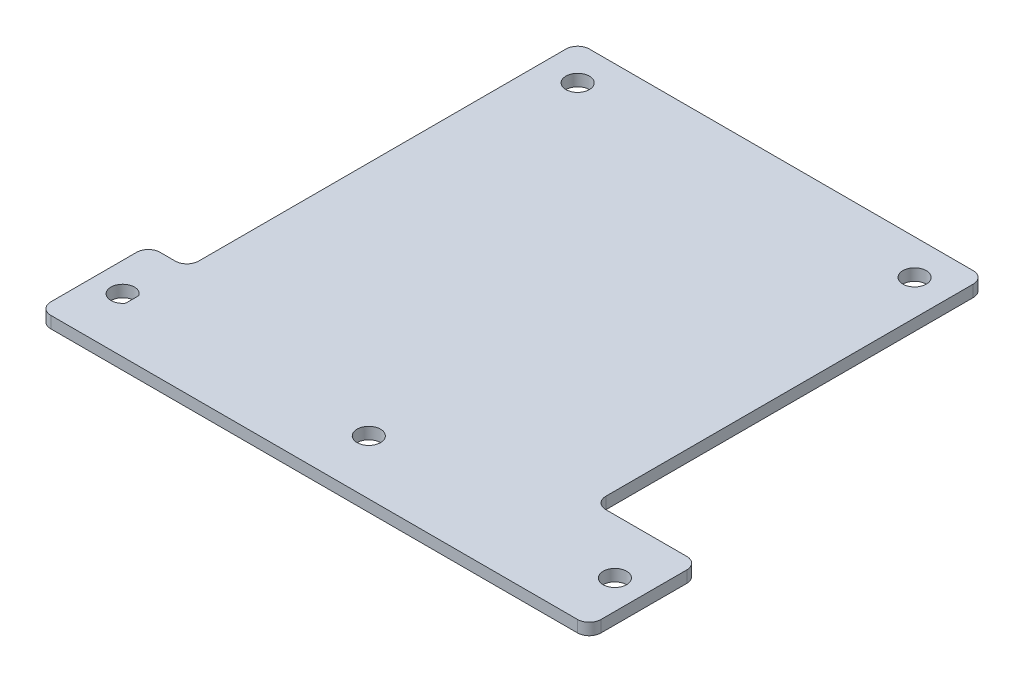
ISO-10303-21;
HEADER;
FILE_DESCRIPTION(('STEP AP214'),'2;1');
FILE_NAME('part.step','',(''),(''),'','','');
FILE_SCHEMA(('AUTOMOTIVE_DESIGN { 1 0 10303 214 1 1 1 1 }'));
ENDSEC;
DATA;
#1=APPLICATION_CONTEXT('core data for automotive mechanical design processes');
#2=APPLICATION_PROTOCOL_DEFINITION('international standard','automotive_design',2000,#1);
#3=PRODUCT_CONTEXT('',#1,'mechanical');
#4=PRODUCT('Part','Part','',(#3));
#5=PRODUCT_RELATED_PRODUCT_CATEGORY('part','',(#4));
#6=PRODUCT_DEFINITION_FORMATION('','',#4);
#7=PRODUCT_DEFINITION_CONTEXT('part definition',#1,'design');
#8=PRODUCT_DEFINITION('design','',#6,#7);
#9=PRODUCT_DEFINITION_SHAPE('','',#8);
#10=(LENGTH_UNIT() NAMED_UNIT(*) SI_UNIT(.MILLI.,.METRE.));
#11=(NAMED_UNIT(*) PLANE_ANGLE_UNIT() SI_UNIT($,.RADIAN.));
#12=(NAMED_UNIT(*) SI_UNIT($,.STERADIAN.) SOLID_ANGLE_UNIT());
#13=UNCERTAINTY_MEASURE_WITH_UNIT(LENGTH_MEASURE(1.E-05),#10,'distance_accuracy_value','');
#14=(GEOMETRIC_REPRESENTATION_CONTEXT(3) GLOBAL_UNCERTAINTY_ASSIGNED_CONTEXT((#13)) GLOBAL_UNIT_ASSIGNED_CONTEXT((#10,
#11,#12)) REPRESENTATION_CONTEXT('',''));
#15=CARTESIAN_POINT('',(0.,0.,0.));
#16=DIRECTION('',(0.,0.,1.));
#17=DIRECTION('',(1.,0.,0.));
#18=AXIS2_PLACEMENT_3D('',#15,#16,#17);
#19=CARTESIAN_POINT('',(-34.75,2.,0.));
#20=DIRECTION('',(1.,0.,0.));
#21=DIRECTION('',(0.,0.,-1.));
#22=AXIS2_PLACEMENT_3D('',#19,#20,#21);
#23=PLANE('',#22);
#24=DIRECTION('',(0.,1.,0.));
#25=VECTOR('',#24,1.);
#26=CARTESIAN_POINT('',(-34.75,0.,33.8656684183733));
#27=LINE('',#26,#25);
#28=CARTESIAN_POINT('',(-34.75,0.,33.8656684183733));
#29=VERTEX_POINT('',#28);
#30=CARTESIAN_POINT('',(-34.75,2.,33.8656684183733));
#31=VERTEX_POINT('',#30);
#32=EDGE_CURVE('E177',#29,#31,#27,.T.);
#33=ORIENTED_EDGE('',*,*,#32,.F.);
#34=DIRECTION('',(0.,0.,1.));
#35=VECTOR('',#34,1.);
#36=CARTESIAN_POINT('',(-34.75,0.,0.));
#37=LINE('',#36,#35);
#38=CARTESIAN_POINT('',(-34.75,0.,36.1343315816268));
#39=VERTEX_POINT('',#38);
#40=EDGE_CURVE('E183',#29,#39,#37,.T.);
#41=ORIENTED_EDGE('',*,*,#40,.T.);
#42=DIRECTION('',(0.,1.,0.));
#43=VECTOR('',#42,1.);
#44=CARTESIAN_POINT('',(-34.75,0.,36.1343315816268));
#45=LINE('',#44,#43);
#46=CARTESIAN_POINT('',(-34.75,2.,36.1343315816268));
#47=VERTEX_POINT('',#46);
#48=EDGE_CURVE('E167',#47,#39,#45,.F.);
#49=ORIENTED_EDGE('',*,*,#48,.F.);
#50=DIRECTION('',(0.,0.,1.));
#51=VECTOR('',#50,1.);
#52=CARTESIAN_POINT('',(-34.75,2.,0.));
#53=LINE('',#52,#51);
#54=EDGE_CURVE('E304',#31,#47,#53,.T.);
#55=ORIENTED_EDGE('',*,*,#54,.F.);
#56=EDGE_LOOP('',(#33,#41,#49,#55));
#57=FACE_BOUND('',#56,.T.);
#58=ADVANCED_FACE('F41',(#57),#23,.F.);
#59=CARTESIAN_POINT('',(-34.75,0.,-39.));
#60=VERTEX_POINT('',#59);
#61=CARTESIAN_POINT('',(-34.75,0.,23.680337554831));
#62=VERTEX_POINT('',#61);
#63=EDGE_CURVE('E187',#60,#62,#37,.T.);
#64=ORIENTED_EDGE('',*,*,#63,.T.);
#65=DIRECTION('',(0.,1.,0.));
#66=VECTOR('',#65,1.);
#67=CARTESIAN_POINT('',(-34.75,2.,23.680337554831));
#68=LINE('',#67,#66);
#69=CARTESIAN_POINT('',(-34.75,2.,23.680337554831));
#70=VERTEX_POINT('',#69);
#71=EDGE_CURVE('E212',#62,#70,#68,.T.);
#72=ORIENTED_EDGE('',*,*,#71,.T.);
#73=CARTESIAN_POINT('',(-34.75,2.,-39.));
#74=VERTEX_POINT('',#73);
#75=EDGE_CURVE('E273',#74,#70,#53,.T.);
#76=ORIENTED_EDGE('',*,*,#75,.F.);
#77=DIRECTION('',(0.,-1.,0.));
#78=VECTOR('',#77,1.);
#79=CARTESIAN_POINT('',(-34.75,2.,-39.));
#80=LINE('',#79,#78);
#81=EDGE_CURVE('E209',#74,#60,#80,.T.);
#82=ORIENTED_EDGE('',*,*,#81,.T.);
#83=EDGE_LOOP('',(#64,#72,#76,#82));
#84=FACE_BOUND('',#83,.T.);
#85=ADVANCED_FACE('F291',(#84),#23,.F.);
#86=CARTESIAN_POINT('',(0.,2.,-41.));
#87=DIRECTION('',(0.,0.,1.));
#88=DIRECTION('',(1.,0.,0.));
#89=AXIS2_PLACEMENT_3D('',#86,#87,#88);
#90=PLANE('',#89);
#91=DIRECTION('',(-1.,0.,0.));
#92=VECTOR('',#91,1.);
#93=CARTESIAN_POINT('',(0.,0.,-41.));
#94=LINE('',#93,#92);
#95=CARTESIAN_POINT('',(32.75,0.,-41.));
#96=VERTEX_POINT('',#95);
#97=CARTESIAN_POINT('',(-32.75,0.,-41.));
#98=VERTEX_POINT('',#97);
#99=EDGE_CURVE('E188',#96,#98,#94,.T.);
#100=ORIENTED_EDGE('',*,*,#99,.T.);
#101=DIRECTION('',(0.,-1.,0.));
#102=VECTOR('',#101,1.);
#103=CARTESIAN_POINT('',(-32.75,2.,-41.));
#104=LINE('',#103,#102);
#105=CARTESIAN_POINT('',(-32.75,2.,-41.));
#106=VERTEX_POINT('',#105);
#107=EDGE_CURVE('E254',#98,#106,#104,.F.);
#108=ORIENTED_EDGE('',*,*,#107,.T.);
#109=DIRECTION('',(-1.,0.,0.));
#110=VECTOR('',#109,1.);
#111=CARTESIAN_POINT('',(0.,2.,-41.));
#112=LINE('',#111,#110);
#113=CARTESIAN_POINT('',(32.75,2.,-41.));
#114=VERTEX_POINT('',#113);
#115=EDGE_CURVE('E301',#114,#106,#112,.T.);
#116=ORIENTED_EDGE('',*,*,#115,.F.);
#117=DIRECTION('',(0.,-1.,0.));
#118=VECTOR('',#117,1.);
#119=CARTESIAN_POINT('',(32.75,0.,-41.));
#120=LINE('',#119,#118);
#121=EDGE_CURVE('E252',#114,#96,#120,.T.);
#122=ORIENTED_EDGE('',*,*,#121,.T.);
#123=EDGE_LOOP('',(#100,#108,#116,#122));
#124=FACE_BOUND('',#123,.T.);
#125=ADVANCED_FACE('F300',(#124),#90,.F.);
#126=CARTESIAN_POINT('',(28.75,2.,-35.));
#127=DIRECTION('',(0.,-1.,0.));
#128=DIRECTION('',(0.,0.,-1.));
#129=AXIS2_PLACEMENT_3D('',#126,#127,#128);
#130=CYLINDRICAL_SURFACE('',#129,2.);
#131=CARTESIAN_POINT('',(28.75,2.,-35.));
#132=DIRECTION('',(0.,1.,0.));
#133=DIRECTION('',(0.,0.,1.));
#134=AXIS2_PLACEMENT_3D('',#131,#132,#133);
#135=CIRCLE('',#134,2.);
#136=CARTESIAN_POINT('',(28.75,2.,-33.));
#137=VERTEX_POINT('',#136);
#138=EDGE_CURVE('E305',#137,#137,#135,.T.);
#139=ORIENTED_EDGE('',*,*,#138,.T.);
#140=EDGE_LOOP('',(#139));
#141=FACE_BOUND('',#140,.T.);
#142=CARTESIAN_POINT('',(28.75,0.,-35.));
#143=DIRECTION('',(0.,1.,0.));
#144=DIRECTION('',(0.,0.,1.));
#145=AXIS2_PLACEMENT_3D('',#142,#143,#144);
#146=CIRCLE('',#145,2.);
#147=CARTESIAN_POINT('',(28.75,0.,-33.));
#148=VERTEX_POINT('',#147);
#149=EDGE_CURVE('E192',#148,#148,#146,.T.);
#150=ORIENTED_EDGE('',*,*,#149,.F.);
#151=EDGE_LOOP('',(#150));
#152=FACE_BOUND('',#151,.T.);
#153=ADVANCED_FACE('F325',(#141,#152),#130,.F.);
#154=CARTESIAN_POINT('',(-28.75,2.,-35.));
#155=DIRECTION('',(0.,-1.,0.));
#156=DIRECTION('',(0.,0.,-1.));
#157=AXIS2_PLACEMENT_3D('',#154,#155,#156);
#158=CYLINDRICAL_SURFACE('',#157,2.);
#159=CARTESIAN_POINT('',(-28.75,2.,-35.));
#160=DIRECTION('',(0.,1.,0.));
#161=DIRECTION('',(0.,0.,1.));
#162=AXIS2_PLACEMENT_3D('',#159,#160,#161);
#163=CIRCLE('',#162,2.);
#164=CARTESIAN_POINT('',(-28.75,2.,-33.));
#165=VERTEX_POINT('',#164);
#166=EDGE_CURVE('E309',#165,#165,#163,.T.);
#167=ORIENTED_EDGE('',*,*,#166,.T.);
#168=EDGE_LOOP('',(#167));
#169=FACE_BOUND('',#168,.T.);
#170=CARTESIAN_POINT('',(-28.75,0.,-35.));
#171=DIRECTION('',(0.,1.,0.));
#172=DIRECTION('',(0.,0.,1.));
#173=AXIS2_PLACEMENT_3D('',#170,#171,#172);
#174=CIRCLE('',#173,2.);
#175=CARTESIAN_POINT('',(-28.75,0.,-33.));
#176=VERTEX_POINT('',#175);
#177=EDGE_CURVE('E318',#176,#176,#174,.T.);
#178=ORIENTED_EDGE('',*,*,#177,.F.);
#179=EDGE_LOOP('',(#178));
#180=FACE_BOUND('',#179,.T.);
#181=ADVANCED_FACE('F327',(#169,#180),#158,.F.);
#182=CARTESIAN_POINT('',(5.60279270796776,2.,35.));
#183=DIRECTION('',(0.,-1.,0.));
#184=DIRECTION('',(0.,0.,-1.));
#185=AXIS2_PLACEMENT_3D('',#182,#183,#184);
#186=CYLINDRICAL_SURFACE('',#185,2.);
#187=CARTESIAN_POINT('',(5.60279270796776,2.,35.));
#188=DIRECTION('',(0.,1.,0.));
#189=DIRECTION('',(0.,0.,1.));
#190=AXIS2_PLACEMENT_3D('',#187,#188,#189);
#191=CIRCLE('',#190,2.);
#192=CARTESIAN_POINT('',(5.60279270796776,2.,37.));
#193=VERTEX_POINT('',#192);
#194=EDGE_CURVE('E198',#193,#193,#191,.T.);
#195=ORIENTED_EDGE('',*,*,#194,.T.);
#196=EDGE_LOOP('',(#195));
#197=FACE_BOUND('',#196,.T.);
#198=CARTESIAN_POINT('',(5.60279270796776,0.,35.));
#199=DIRECTION('',(0.,1.,0.));
#200=DIRECTION('',(0.,0.,1.));
#201=AXIS2_PLACEMENT_3D('',#198,#199,#200);
#202=CIRCLE('',#201,2.);
#203=CARTESIAN_POINT('',(5.60279270796776,0.,37.));
#204=VERTEX_POINT('',#203);
#205=EDGE_CURVE('E315',#204,#204,#202,.T.);
#206=ORIENTED_EDGE('',*,*,#205,.F.);
#207=EDGE_LOOP('',(#206));
#208=FACE_BOUND('',#207,.T.);
#209=ADVANCED_FACE('F333',(#197,#208),#186,.F.);
#210=CARTESIAN_POINT('',(34.75,2.,0.));
#211=DIRECTION('',(1.,0.,0.));
#212=DIRECTION('',(0.,0.,-1.));
#213=AXIS2_PLACEMENT_3D('',#210,#211,#212);
#214=PLANE('',#213);
#215=DIRECTION('',(0.,0.,1.));
#216=VECTOR('',#215,1.);
#217=CARTESIAN_POINT('',(34.75,2.,0.));
#218=LINE('',#217,#216);
#219=CARTESIAN_POINT('',(34.75,2.,-39.));
#220=VERTEX_POINT('',#219);
#221=CARTESIAN_POINT('',(34.75,2.,23.680337554831));
#222=VERTEX_POINT('',#221);
#223=EDGE_CURVE('E202',#220,#222,#218,.T.);
#224=ORIENTED_EDGE('',*,*,#223,.T.);
#225=DIRECTION('',(0.,1.,0.));
#226=VECTOR('',#225,1.);
#227=CARTESIAN_POINT('',(34.75,0.,23.680337554831));
#228=LINE('',#227,#226);
#229=CARTESIAN_POINT('',(34.75,0.,23.680337554831));
#230=VERTEX_POINT('',#229);
#231=EDGE_CURVE('E207',#222,#230,#228,.F.);
#232=ORIENTED_EDGE('',*,*,#231,.T.);
#233=DIRECTION('',(0.,0.,1.));
#234=VECTOR('',#233,1.);
#235=CARTESIAN_POINT('',(34.75,0.,0.));
#236=LINE('',#235,#234);
#237=CARTESIAN_POINT('',(34.75,0.,-39.));
#238=VERTEX_POINT('',#237);
#239=EDGE_CURVE('E191',#238,#230,#236,.T.);
#240=ORIENTED_EDGE('',*,*,#239,.F.);
#241=DIRECTION('',(0.,-1.,0.));
#242=VECTOR('',#241,1.);
#243=CARTESIAN_POINT('',(34.75,2.,-39.));
#244=LINE('',#243,#242);
#245=EDGE_CURVE('E205',#238,#220,#244,.F.);
#246=ORIENTED_EDGE('',*,*,#245,.T.);
#247=EDGE_LOOP('',(#224,#232,#240,#246));
#248=FACE_BOUND('',#247,.T.);
#249=ADVANCED_FACE('F346',(#248),#214,.T.);
#250=CARTESIAN_POINT('',(0.,2.,0.));
#251=DIRECTION('',(0.,1.,0.));
#252=DIRECTION('',(0.,0.,1.));
#253=AXIS2_PLACEMENT_3D('',#250,#251,#252);
#254=PLANE('',#253);
#255=CARTESIAN_POINT('',(-36.3972072920322,2.,35.));
#256=DIRECTION('',(0.,1.,0.));
#257=DIRECTION('',(0.,0.,1.));
#258=AXIS2_PLACEMENT_3D('',#255,#256,#257);
#259=CIRCLE('',#258,2.);
#260=EDGE_CURVE('E173',#31,#47,#259,.T.);
#261=ORIENTED_EDGE('',*,*,#260,.F.);
#262=ORIENTED_EDGE('',*,*,#54,.T.);
#263=EDGE_LOOP('',(#261,#262));
#264=FACE_BOUND('',#263,.T.);
#265=DIRECTION('',(0.,0.,1.));
#266=VECTOR('',#265,1.);
#267=CARTESIAN_POINT('',(-41.3433725373738,2.,0.));
#268=LINE('',#267,#266);
#269=CARTESIAN_POINT('',(-41.3433725373738,2.,27.680337554831));
#270=VERTEX_POINT('',#269);
#271=CARTESIAN_POINT('',(-41.3433725373738,2.,42.319662445169));
#272=VERTEX_POINT('',#271);
#273=EDGE_CURVE('E282',#270,#272,#268,.T.);
#274=ORIENTED_EDGE('',*,*,#273,.T.);
#275=CARTESIAN_POINT('',(-39.3433725373738,2.,42.319662445169));
#276=DIRECTION('',(0.,1.,0.));
#277=DIRECTION('',(0.,0.,1.));
#278=AXIS2_PLACEMENT_3D('',#275,#276,#277);
#279=CIRCLE('',#278,2.);
#280=CARTESIAN_POINT('',(-39.3433725373738,2.,44.319662445169));
#281=VERTEX_POINT('',#280);
#282=EDGE_CURVE('E235',#272,#281,#279,.T.);
#283=ORIENTED_EDGE('',*,*,#282,.T.);
#284=DIRECTION('',(-1.,0.,0.));
#285=VECTOR('',#284,1.);
#286=CARTESIAN_POINT('',(0.,2.,44.319662445169));
#287=LINE('',#286,#285);
#288=CARTESIAN_POINT('',(50.5489579533093,2.,44.319662445169));
#289=VERTEX_POINT('',#288);
#290=EDGE_CURVE('E600',#289,#281,#287,.T.);
#291=ORIENTED_EDGE('',*,*,#290,.F.);
#292=CARTESIAN_POINT('',(50.5489579533093,2.,42.319662445169));
#293=DIRECTION('',(0.,1.,0.));
#294=DIRECTION('',(0.,0.,1.));
#295=AXIS2_PLACEMENT_3D('',#292,#293,#294);
#296=CIRCLE('',#295,2.);
#297=CARTESIAN_POINT('',(52.5489579533093,2.,42.319662445169));
#298=VERTEX_POINT('',#297);
#299=EDGE_CURVE('E225',#289,#298,#296,.T.);
#300=ORIENTED_EDGE('',*,*,#299,.T.);
#301=DIRECTION('',(0.,0.,1.));
#302=VECTOR('',#301,1.);
#303=CARTESIAN_POINT('',(52.5489579533093,2.,0.));
#304=LINE('',#303,#302);
#305=CARTESIAN_POINT('',(52.5489579533093,2.,27.680337554831));
#306=VERTEX_POINT('',#305);
#307=EDGE_CURVE('E597',#306,#298,#304,.T.);
#308=ORIENTED_EDGE('',*,*,#307,.F.);
#309=CARTESIAN_POINT('',(50.5489579533093,2.,27.680337554831));
#310=DIRECTION('',(0.,1.,0.));
#311=DIRECTION('',(0.,0.,1.));
#312=AXIS2_PLACEMENT_3D('',#309,#310,#311);
#313=CIRCLE('',#312,2.);
#314=CARTESIAN_POINT('',(50.5489579533093,2.,25.680337554831));
#315=VERTEX_POINT('',#314);
#316=EDGE_CURVE('E227',#306,#315,#313,.T.);
#317=ORIENTED_EDGE('',*,*,#316,.T.);
#318=DIRECTION('',(-1.,0.,0.));
#319=VECTOR('',#318,1.);
#320=CARTESIAN_POINT('',(0.,2.,25.680337554831));
#321=LINE('',#320,#319);
#322=CARTESIAN_POINT('',(36.75,2.,25.680337554831));
#323=VERTEX_POINT('',#322);
#324=EDGE_CURVE('E185',#315,#323,#321,.T.);
#325=ORIENTED_EDGE('',*,*,#324,.T.);
#326=CARTESIAN_POINT('',(36.75,2.,23.680337554831));
#327=DIRECTION('',(0.,1.,0.));
#328=DIRECTION('',(0.,0.,1.));
#329=AXIS2_PLACEMENT_3D('',#326,#327,#328);
#330=CIRCLE('',#329,2.);
#331=EDGE_CURVE('E261',#323,#222,#330,.F.);
#332=ORIENTED_EDGE('',*,*,#331,.T.);
#333=ORIENTED_EDGE('',*,*,#223,.F.);
#334=CARTESIAN_POINT('',(32.75,2.,-39.));
#335=DIRECTION('',(0.,1.,0.));
#336=DIRECTION('',(0.,0.,1.));
#337=AXIS2_PLACEMENT_3D('',#334,#335,#336);
#338=CIRCLE('',#337,2.);
#339=EDGE_CURVE('E229',#220,#114,#338,.T.);
#340=ORIENTED_EDGE('',*,*,#339,.T.);
#341=ORIENTED_EDGE('',*,*,#115,.T.);
#342=CARTESIAN_POINT('',(-32.75,2.,-39.));
#343=DIRECTION('',(0.,1.,0.));
#344=DIRECTION('',(0.,0.,1.));
#345=AXIS2_PLACEMENT_3D('',#342,#343,#344);
#346=CIRCLE('',#345,2.);
#347=EDGE_CURVE('E231',#106,#74,#346,.T.);
#348=ORIENTED_EDGE('',*,*,#347,.T.);
#349=ORIENTED_EDGE('',*,*,#75,.T.);
#350=CARTESIAN_POINT('',(-36.75,2.,23.680337554831));
#351=DIRECTION('',(0.,1.,0.));
#352=DIRECTION('',(0.,0.,1.));
#353=AXIS2_PLACEMENT_3D('',#350,#351,#352);
#354=CIRCLE('',#353,2.);
#355=CARTESIAN_POINT('',(-36.75,2.,25.680337554831));
#356=VERTEX_POINT('',#355);
#357=EDGE_CURVE('E49',#70,#356,#354,.F.);
#358=ORIENTED_EDGE('',*,*,#357,.T.);
#359=CARTESIAN_POINT('',(-39.3433725373738,2.,25.680337554831));
#360=VERTEX_POINT('',#359);
#361=EDGE_CURVE('E271',#356,#360,#321,.T.);
#362=ORIENTED_EDGE('',*,*,#361,.T.);
#363=CARTESIAN_POINT('',(-39.3433725373738,2.,27.680337554831));
#364=DIRECTION('',(0.,1.,0.));
#365=DIRECTION('',(0.,0.,1.));
#366=AXIS2_PLACEMENT_3D('',#363,#364,#365);
#367=CIRCLE('',#366,2.);
#368=EDGE_CURVE('E233',#360,#270,#367,.T.);
#369=ORIENTED_EDGE('',*,*,#368,.T.);
#370=EDGE_LOOP('',(#274,#283,#291,#300,#308,#317,#325,#332,#333,#340,#341,#348,#349,#358,#362,#369));
#371=FACE_BOUND('',#370,.T.);
#372=ORIENTED_EDGE('',*,*,#166,.F.);
#373=EDGE_LOOP('',(#372));
#374=FACE_BOUND('',#373,.T.);
#375=ORIENTED_EDGE('',*,*,#138,.F.);
#376=EDGE_LOOP('',(#375));
#377=FACE_BOUND('',#376,.T.);
#378=CARTESIAN_POINT('',(47.6027927079678,2.,35.));
#379=DIRECTION('',(0.,1.,0.));
#380=DIRECTION('',(0.,0.,1.));
#381=AXIS2_PLACEMENT_3D('',#378,#379,#380);
#382=CIRCLE('',#381,2.);
#383=CARTESIAN_POINT('',(47.6027927079678,2.,37.));
#384=VERTEX_POINT('',#383);
#385=EDGE_CURVE('E283',#384,#384,#382,.T.);
#386=ORIENTED_EDGE('',*,*,#385,.F.);
#387=EDGE_LOOP('',(#386));
#388=FACE_BOUND('',#387,.T.);
#389=ORIENTED_EDGE('',*,*,#194,.F.);
#390=EDGE_LOOP('',(#389));
#391=FACE_BOUND('',#390,.T.);
#392=ADVANCED_FACE('F269',(#264,#371,#374,#377,#388,#391),#254,.T.);
#393=CARTESIAN_POINT('',(0.,0.,0.));
#394=DIRECTION('',(0.,1.,0.));
#395=DIRECTION('',(0.,0.,1.));
#396=AXIS2_PLACEMENT_3D('',#393,#394,#395);
#397=PLANE('',#396);
#398=ORIENTED_EDGE('',*,*,#40,.F.);
#399=CARTESIAN_POINT('',(-36.3972072920322,0.,35.));
#400=DIRECTION('',(0.,1.,0.));
#401=DIRECTION('',(0.,0.,1.));
#402=AXIS2_PLACEMENT_3D('',#399,#400,#401);
#403=CIRCLE('',#402,2.);
#404=EDGE_CURVE('E171',#29,#39,#403,.T.);
#405=ORIENTED_EDGE('',*,*,#404,.T.);
#406=EDGE_LOOP('',(#398,#405));
#407=FACE_BOUND('',#406,.T.);
#408=DIRECTION('',(-1.,0.,0.));
#409=VECTOR('',#408,1.);
#410=CARTESIAN_POINT('',(0.,0.,44.319662445169));
#411=LINE('',#410,#409);
#412=CARTESIAN_POINT('',(50.5489579533093,0.,44.319662445169));
#413=VERTEX_POINT('',#412);
#414=CARTESIAN_POINT('',(-39.3433725373738,0.,44.319662445169));
#415=VERTEX_POINT('',#414);
#416=EDGE_CURVE('E610',#413,#415,#411,.T.);
#417=ORIENTED_EDGE('',*,*,#416,.T.);
#418=CARTESIAN_POINT('',(-39.3433725373738,0.,42.319662445169));
#419=DIRECTION('',(0.,1.,0.));
#420=DIRECTION('',(0.,0.,1.));
#421=AXIS2_PLACEMENT_3D('',#418,#419,#420);
#422=CIRCLE('',#421,2.);
#423=CARTESIAN_POINT('',(-41.3433725373738,0.,42.319662445169));
#424=VERTEX_POINT('',#423);
#425=EDGE_CURVE('E250',#415,#424,#422,.F.);
#426=ORIENTED_EDGE('',*,*,#425,.T.);
#427=DIRECTION('',(0.,0.,1.));
#428=VECTOR('',#427,1.);
#429=CARTESIAN_POINT('',(-41.3433725373738,0.,0.));
#430=LINE('',#429,#428);
#431=CARTESIAN_POINT('',(-41.3433725373738,0.,27.680337554831));
#432=VERTEX_POINT('',#431);
#433=EDGE_CURVE('E612',#432,#424,#430,.T.);
#434=ORIENTED_EDGE('',*,*,#433,.F.);
#435=CARTESIAN_POINT('',(-39.3433725373738,0.,27.680337554831));
#436=DIRECTION('',(0.,1.,0.));
#437=DIRECTION('',(0.,0.,1.));
#438=AXIS2_PLACEMENT_3D('',#435,#436,#437);
#439=CIRCLE('',#438,2.);
#440=CARTESIAN_POINT('',(-39.3433725373738,0.,25.680337554831));
#441=VERTEX_POINT('',#440);
#442=EDGE_CURVE('E248',#432,#441,#439,.F.);
#443=ORIENTED_EDGE('',*,*,#442,.T.);
#444=DIRECTION('',(-1.,0.,0.));
#445=VECTOR('',#444,1.);
#446=CARTESIAN_POINT('',(0.,0.,25.680337554831));
#447=LINE('',#446,#445);
#448=CARTESIAN_POINT('',(-36.75,0.,25.680337554831));
#449=VERTEX_POINT('',#448);
#450=EDGE_CURVE('E289',#449,#441,#447,.T.);
#451=ORIENTED_EDGE('',*,*,#450,.F.);
#452=CARTESIAN_POINT('',(-36.75,0.,23.680337554831));
#453=DIRECTION('',(0.,1.,0.));
#454=DIRECTION('',(0.,0.,1.));
#455=AXIS2_PLACEMENT_3D('',#452,#453,#454);
#456=CIRCLE('',#455,2.);
#457=EDGE_CURVE('E11',#449,#62,#456,.T.);
#458=ORIENTED_EDGE('',*,*,#457,.T.);
#459=ORIENTED_EDGE('',*,*,#63,.F.);
#460=CARTESIAN_POINT('',(-32.75,0.,-39.));
#461=DIRECTION('',(0.,1.,0.));
#462=DIRECTION('',(0.,0.,1.));
#463=AXIS2_PLACEMENT_3D('',#460,#461,#462);
#464=CIRCLE('',#463,2.);
#465=EDGE_CURVE('E56',#60,#98,#464,.F.);
#466=ORIENTED_EDGE('',*,*,#465,.T.);
#467=ORIENTED_EDGE('',*,*,#99,.F.);
#468=CARTESIAN_POINT('',(32.75,0.,-39.));
#469=DIRECTION('',(0.,1.,0.));
#470=DIRECTION('',(0.,0.,1.));
#471=AXIS2_PLACEMENT_3D('',#468,#469,#470);
#472=CIRCLE('',#471,2.);
#473=EDGE_CURVE('E64',#96,#238,#472,.F.);
#474=ORIENTED_EDGE('',*,*,#473,.T.);
#475=ORIENTED_EDGE('',*,*,#239,.T.);
#476=CARTESIAN_POINT('',(36.75,0.,23.680337554831));
#477=DIRECTION('',(0.,1.,0.));
#478=DIRECTION('',(0.,0.,1.));
#479=AXIS2_PLACEMENT_3D('',#476,#477,#478);
#480=CIRCLE('',#479,2.);
#481=CARTESIAN_POINT('',(36.75,0.,25.680337554831));
#482=VERTEX_POINT('',#481);
#483=EDGE_CURVE('E263',#230,#482,#480,.T.);
#484=ORIENTED_EDGE('',*,*,#483,.T.);
#485=CARTESIAN_POINT('',(50.5489579533093,0.,25.680337554831));
#486=VERTEX_POINT('',#485);
#487=EDGE_CURVE('E178',#486,#482,#447,.T.);
#488=ORIENTED_EDGE('',*,*,#487,.F.);
#489=CARTESIAN_POINT('',(50.5489579533093,0.,27.680337554831));
#490=DIRECTION('',(0.,1.,0.));
#491=DIRECTION('',(0.,0.,1.));
#492=AXIS2_PLACEMENT_3D('',#489,#490,#491);
#493=CIRCLE('',#492,2.);
#494=CARTESIAN_POINT('',(52.5489579533093,0.,27.680337554831));
#495=VERTEX_POINT('',#494);
#496=EDGE_CURVE('E244',#486,#495,#493,.F.);
#497=ORIENTED_EDGE('',*,*,#496,.T.);
#498=DIRECTION('',(0.,0.,1.));
#499=VECTOR('',#498,1.);
#500=CARTESIAN_POINT('',(52.5489579533093,0.,0.));
#501=LINE('',#500,#499);
#502=CARTESIAN_POINT('',(52.5489579533093,0.,42.319662445169));
#503=VERTEX_POINT('',#502);
#504=EDGE_CURVE('E607',#495,#503,#501,.T.);
#505=ORIENTED_EDGE('',*,*,#504,.T.);
#506=CARTESIAN_POINT('',(50.5489579533093,0.,42.319662445169));
#507=DIRECTION('',(0.,1.,0.));
#508=DIRECTION('',(0.,0.,1.));
#509=AXIS2_PLACEMENT_3D('',#506,#507,#508);
#510=CIRCLE('',#509,2.);
#511=EDGE_CURVE('E242',#503,#413,#510,.F.);
#512=ORIENTED_EDGE('',*,*,#511,.T.);
#513=EDGE_LOOP('',(#417,#426,#434,#443,#451,#458,#459,#466,#467,#474,#475,#484,#488,#497,#505,#512));
#514=FACE_BOUND('',#513,.T.);
#515=ORIENTED_EDGE('',*,*,#177,.T.);
#516=EDGE_LOOP('',(#515));
#517=FACE_BOUND('',#516,.T.);
#518=ORIENTED_EDGE('',*,*,#149,.T.);
#519=EDGE_LOOP('',(#518));
#520=FACE_BOUND('',#519,.T.);
#521=CARTESIAN_POINT('',(47.6027927079678,0.,35.));
#522=DIRECTION('',(0.,1.,0.));
#523=DIRECTION('',(0.,0.,1.));
#524=AXIS2_PLACEMENT_3D('',#521,#522,#523);
#525=CIRCLE('',#524,2.);
#526=CARTESIAN_POINT('',(47.6027927079678,0.,37.));
#527=VERTEX_POINT('',#526);
#528=EDGE_CURVE('E184',#527,#527,#525,.T.);
#529=ORIENTED_EDGE('',*,*,#528,.T.);
#530=EDGE_LOOP('',(#529));
#531=FACE_BOUND('',#530,.T.);
#532=ORIENTED_EDGE('',*,*,#205,.T.);
#533=EDGE_LOOP('',(#532));
#534=FACE_BOUND('',#533,.T.);
#535=ADVANCED_FACE('F182',(#407,#514,#517,#520,#531,#534),#397,.F.);
#536=CARTESIAN_POINT('',(-36.3972072920322,0.,35.));
#537=DIRECTION('',(0.,1.,0.));
#538=DIRECTION('',(0.,0.,1.));
#539=AXIS2_PLACEMENT_3D('',#536,#537,#538);
#540=CYLINDRICAL_SURFACE('',#539,2.);
#541=ORIENTED_EDGE('',*,*,#404,.F.);
#542=ORIENTED_EDGE('',*,*,#32,.T.);
#543=ORIENTED_EDGE('',*,*,#260,.T.);
#544=ORIENTED_EDGE('',*,*,#48,.T.);
#545=EDGE_LOOP('',(#541,#542,#543,#544));
#546=FACE_BOUND('',#545,.T.);
#547=ADVANCED_FACE('F169',(#546),#540,.F.);
#548=CARTESIAN_POINT('',(0.,0.,25.680337554831));
#549=DIRECTION('',(0.,0.,-1.));
#550=DIRECTION('',(-1.,0.,0.));
#551=AXIS2_PLACEMENT_3D('',#548,#549,#550);
#552=PLANE('',#551);
#553=ORIENTED_EDGE('',*,*,#487,.T.);
#554=DIRECTION('',(0.,1.,0.));
#555=VECTOR('',#554,1.);
#556=CARTESIAN_POINT('',(36.75,2.,25.680337554831));
#557=LINE('',#556,#555);
#558=EDGE_CURVE('E201',#482,#323,#557,.T.);
#559=ORIENTED_EDGE('',*,*,#558,.T.);
#560=ORIENTED_EDGE('',*,*,#324,.F.);
#561=DIRECTION('',(0.,1.,0.));
#562=VECTOR('',#561,1.);
#563=CARTESIAN_POINT('',(50.5489579533093,0.,25.680337554831));
#564=LINE('',#563,#562);
#565=EDGE_CURVE('E199',#315,#486,#564,.F.);
#566=ORIENTED_EDGE('',*,*,#565,.T.);
#567=EDGE_LOOP('',(#553,#559,#560,#566));
#568=FACE_BOUND('',#567,.T.);
#569=ADVANCED_FACE('F356',(#568),#552,.T.);
#570=CARTESIAN_POINT('',(52.5489579533093,0.,0.));
#571=DIRECTION('',(-1.,0.,0.));
#572=DIRECTION('',(0.,0.,1.));
#573=AXIS2_PLACEMENT_3D('',#570,#571,#572);
#574=PLANE('',#573);
#575=ORIENTED_EDGE('',*,*,#504,.F.);
#576=DIRECTION('',(0.,1.,0.));
#577=VECTOR('',#576,1.);
#578=CARTESIAN_POINT('',(52.5489579533093,2.,27.680337554831));
#579=LINE('',#578,#577);
#580=EDGE_CURVE('E258',#495,#306,#579,.T.);
#581=ORIENTED_EDGE('',*,*,#580,.T.);
#582=ORIENTED_EDGE('',*,*,#307,.T.);
#583=DIRECTION('',(0.,1.,0.));
#584=VECTOR('',#583,1.);
#585=CARTESIAN_POINT('',(52.5489579533093,0.,42.319662445169));
#586=LINE('',#585,#584);
#587=EDGE_CURVE('E256',#298,#503,#586,.F.);
#588=ORIENTED_EDGE('',*,*,#587,.T.);
#589=EDGE_LOOP('',(#575,#581,#582,#588));
#590=FACE_BOUND('',#589,.T.);
#591=ADVANCED_FACE('F369',(#590),#574,.F.);
#592=CARTESIAN_POINT('',(0.,0.,44.319662445169));
#593=DIRECTION('',(0.,0.,-1.));
#594=DIRECTION('',(-1.,0.,0.));
#595=AXIS2_PLACEMENT_3D('',#592,#593,#594);
#596=PLANE('',#595);
#597=ORIENTED_EDGE('',*,*,#290,.T.);
#598=DIRECTION('',(0.,1.,0.));
#599=VECTOR('',#598,1.);
#600=CARTESIAN_POINT('',(-39.3433725373738,0.,44.319662445169));
#601=LINE('',#600,#599);
#602=EDGE_CURVE('E240',#281,#415,#601,.F.);
#603=ORIENTED_EDGE('',*,*,#602,.T.);
#604=ORIENTED_EDGE('',*,*,#416,.F.);
#605=DIRECTION('',(0.,1.,0.));
#606=VECTOR('',#605,1.);
#607=CARTESIAN_POINT('',(50.5489579533093,0.,44.319662445169));
#608=LINE('',#607,#606);
#609=EDGE_CURVE('E237',#413,#289,#608,.T.);
#610=ORIENTED_EDGE('',*,*,#609,.T.);
#611=EDGE_LOOP('',(#597,#603,#604,#610));
#612=FACE_BOUND('',#611,.T.);
#613=ADVANCED_FACE('F365',(#612),#596,.F.);
#614=CARTESIAN_POINT('',(-41.3433725373738,0.,0.));
#615=DIRECTION('',(-1.,0.,0.));
#616=DIRECTION('',(0.,0.,1.));
#617=AXIS2_PLACEMENT_3D('',#614,#615,#616);
#618=PLANE('',#617);
#619=ORIENTED_EDGE('',*,*,#433,.T.);
#620=DIRECTION('',(0.,1.,0.));
#621=VECTOR('',#620,1.);
#622=CARTESIAN_POINT('',(-41.3433725373738,2.,42.319662445169));
#623=LINE('',#622,#621);
#624=EDGE_CURVE('E222',#424,#272,#623,.T.);
#625=ORIENTED_EDGE('',*,*,#624,.T.);
#626=ORIENTED_EDGE('',*,*,#273,.F.);
#627=DIRECTION('',(0.,1.,0.));
#628=VECTOR('',#627,1.);
#629=CARTESIAN_POINT('',(-41.3433725373738,0.,27.680337554831));
#630=LINE('',#629,#628);
#631=EDGE_CURVE('E220',#270,#432,#630,.F.);
#632=ORIENTED_EDGE('',*,*,#631,.T.);
#633=EDGE_LOOP('',(#619,#625,#626,#632));
#634=FACE_BOUND('',#633,.T.);
#635=ADVANCED_FACE('F362',(#634),#618,.T.);
#636=ORIENTED_EDGE('',*,*,#361,.F.);
#637=DIRECTION('',(0.,1.,0.));
#638=VECTOR('',#637,1.);
#639=CARTESIAN_POINT('',(-36.75,0.,25.680337554831));
#640=LINE('',#639,#638);
#641=EDGE_CURVE('E218',#356,#449,#640,.F.);
#642=ORIENTED_EDGE('',*,*,#641,.T.);
#643=ORIENTED_EDGE('',*,*,#450,.T.);
#644=DIRECTION('',(0.,1.,0.));
#645=VECTOR('',#644,1.);
#646=CARTESIAN_POINT('',(-39.3433725373738,0.,25.680337554831));
#647=LINE('',#646,#645);
#648=EDGE_CURVE('E215',#441,#360,#647,.T.);
#649=ORIENTED_EDGE('',*,*,#648,.T.);
#650=EDGE_LOOP('',(#636,#642,#643,#649));
#651=FACE_BOUND('',#650,.T.);
#652=ADVANCED_FACE('F278',(#651),#552,.T.);
#653=CARTESIAN_POINT('',(47.6027927079678,0.,35.));
#654=DIRECTION('',(0.,1.,0.));
#655=DIRECTION('',(0.,0.,1.));
#656=AXIS2_PLACEMENT_3D('',#653,#654,#655);
#657=CYLINDRICAL_SURFACE('',#656,2.);
#658=ORIENTED_EDGE('',*,*,#528,.F.);
#659=EDGE_LOOP('',(#658));
#660=FACE_BOUND('',#659,.T.);
#661=ORIENTED_EDGE('',*,*,#385,.T.);
#662=EDGE_LOOP('',(#661));
#663=FACE_BOUND('',#662,.T.);
#664=ADVANCED_FACE('F357',(#660,#663),#657,.F.);
#665=CARTESIAN_POINT('',(36.75,0.,23.680337554831));
#666=DIRECTION('',(0.,-1.,0.));
#667=DIRECTION('',(0.,0.,-1.));
#668=AXIS2_PLACEMENT_3D('',#665,#666,#667);
#669=CYLINDRICAL_SURFACE('',#668,2.);
#670=ORIENTED_EDGE('',*,*,#483,.F.);
#671=ORIENTED_EDGE('',*,*,#231,.F.);
#672=ORIENTED_EDGE('',*,*,#331,.F.);
#673=ORIENTED_EDGE('',*,*,#558,.F.);
#674=EDGE_LOOP('',(#670,#671,#672,#673));
#675=FACE_BOUND('',#674,.T.);
#676=ADVANCED_FACE('F360',(#675),#669,.F.);
#677=CARTESIAN_POINT('',(-36.75,2.,23.680337554831));
#678=DIRECTION('',(0.,1.,0.));
#679=DIRECTION('',(0.,0.,1.));
#680=AXIS2_PLACEMENT_3D('',#677,#678,#679);
#681=CYLINDRICAL_SURFACE('',#680,2.);
#682=ORIENTED_EDGE('',*,*,#457,.F.);
#683=ORIENTED_EDGE('',*,*,#641,.F.);
#684=ORIENTED_EDGE('',*,*,#357,.F.);
#685=ORIENTED_EDGE('',*,*,#71,.F.);
#686=EDGE_LOOP('',(#682,#683,#684,#685));
#687=FACE_BOUND('',#686,.T.);
#688=ADVANCED_FACE('F286',(#687),#681,.F.);
#689=CARTESIAN_POINT('',(-39.3433725373738,0.,42.319662445169));
#690=DIRECTION('',(0.,-1.,0.));
#691=DIRECTION('',(0.,0.,-1.));
#692=AXIS2_PLACEMENT_3D('',#689,#690,#691);
#693=CYLINDRICAL_SURFACE('',#692,2.);
#694=ORIENTED_EDGE('',*,*,#425,.F.);
#695=ORIENTED_EDGE('',*,*,#602,.F.);
#696=ORIENTED_EDGE('',*,*,#282,.F.);
#697=ORIENTED_EDGE('',*,*,#624,.F.);
#698=EDGE_LOOP('',(#694,#695,#696,#697));
#699=FACE_BOUND('',#698,.T.);
#700=ADVANCED_FACE('F400',(#699),#693,.T.);
#701=CARTESIAN_POINT('',(-39.3433725373738,0.,27.680337554831));
#702=DIRECTION('',(0.,1.,0.));
#703=DIRECTION('',(0.,0.,1.));
#704=AXIS2_PLACEMENT_3D('',#701,#702,#703);
#705=CYLINDRICAL_SURFACE('',#704,2.);
#706=ORIENTED_EDGE('',*,*,#442,.F.);
#707=ORIENTED_EDGE('',*,*,#631,.F.);
#708=ORIENTED_EDGE('',*,*,#368,.F.);
#709=ORIENTED_EDGE('',*,*,#648,.F.);
#710=EDGE_LOOP('',(#706,#707,#708,#709));
#711=FACE_BOUND('',#710,.T.);
#712=ADVANCED_FACE('F408',(#711),#705,.T.);
#713=CARTESIAN_POINT('',(-32.75,2.,-39.));
#714=DIRECTION('',(0.,-1.,0.));
#715=DIRECTION('',(0.,0.,-1.));
#716=AXIS2_PLACEMENT_3D('',#713,#714,#715);
#717=CYLINDRICAL_SURFACE('',#716,2.);
#718=ORIENTED_EDGE('',*,*,#347,.F.);
#719=ORIENTED_EDGE('',*,*,#107,.F.);
#720=ORIENTED_EDGE('',*,*,#465,.F.);
#721=ORIENTED_EDGE('',*,*,#81,.F.);
#722=EDGE_LOOP('',(#718,#719,#720,#721));
#723=FACE_BOUND('',#722,.T.);
#724=ADVANCED_FACE('F295',(#723),#717,.T.);
#725=CARTESIAN_POINT('',(32.75,2.,-39.));
#726=DIRECTION('',(0.,1.,0.));
#727=DIRECTION('',(0.,0.,1.));
#728=AXIS2_PLACEMENT_3D('',#725,#726,#727);
#729=CYLINDRICAL_SURFACE('',#728,2.);
#730=ORIENTED_EDGE('',*,*,#339,.F.);
#731=ORIENTED_EDGE('',*,*,#245,.F.);
#732=ORIENTED_EDGE('',*,*,#473,.F.);
#733=ORIENTED_EDGE('',*,*,#121,.F.);
#734=EDGE_LOOP('',(#730,#731,#732,#733));
#735=FACE_BOUND('',#734,.T.);
#736=ADVANCED_FACE('F425',(#735),#729,.T.);
#737=CARTESIAN_POINT('',(50.5489579533093,0.,27.680337554831));
#738=DIRECTION('',(0.,-1.,0.));
#739=DIRECTION('',(0.,0.,-1.));
#740=AXIS2_PLACEMENT_3D('',#737,#738,#739);
#741=CYLINDRICAL_SURFACE('',#740,2.);
#742=ORIENTED_EDGE('',*,*,#496,.F.);
#743=ORIENTED_EDGE('',*,*,#565,.F.);
#744=ORIENTED_EDGE('',*,*,#316,.F.);
#745=ORIENTED_EDGE('',*,*,#580,.F.);
#746=EDGE_LOOP('',(#742,#743,#744,#745));
#747=FACE_BOUND('',#746,.T.);
#748=ADVANCED_FACE('F433',(#747),#741,.T.);
#749=CARTESIAN_POINT('',(50.5489579533093,0.,42.319662445169));
#750=DIRECTION('',(0.,1.,0.));
#751=DIRECTION('',(0.,0.,1.));
#752=AXIS2_PLACEMENT_3D('',#749,#750,#751);
#753=CYLINDRICAL_SURFACE('',#752,2.);
#754=ORIENTED_EDGE('',*,*,#511,.F.);
#755=ORIENTED_EDGE('',*,*,#587,.F.);
#756=ORIENTED_EDGE('',*,*,#299,.F.);
#757=ORIENTED_EDGE('',*,*,#609,.F.);
#758=EDGE_LOOP('',(#754,#755,#756,#757));
#759=FACE_BOUND('',#758,.T.);
#760=ADVANCED_FACE('F43',(#759),#753,.T.);
#761=CLOSED_SHELL('',(#58,#85,#125,#153,#181,#209,#249,#392,#535,#547,#569,#591,#613,#635,#652,
#664,#676,#688,#700,#712,#724,#736,#748,#760));
#762=MANIFOLD_SOLID_BREP('B2',#761);
#763=ADVANCED_BREP_SHAPE_REPRESENTATION('',(#18,#762),#14);
#764=SHAPE_DEFINITION_REPRESENTATION(#9,#763);
ENDSEC;
END-ISO-10303-21;
